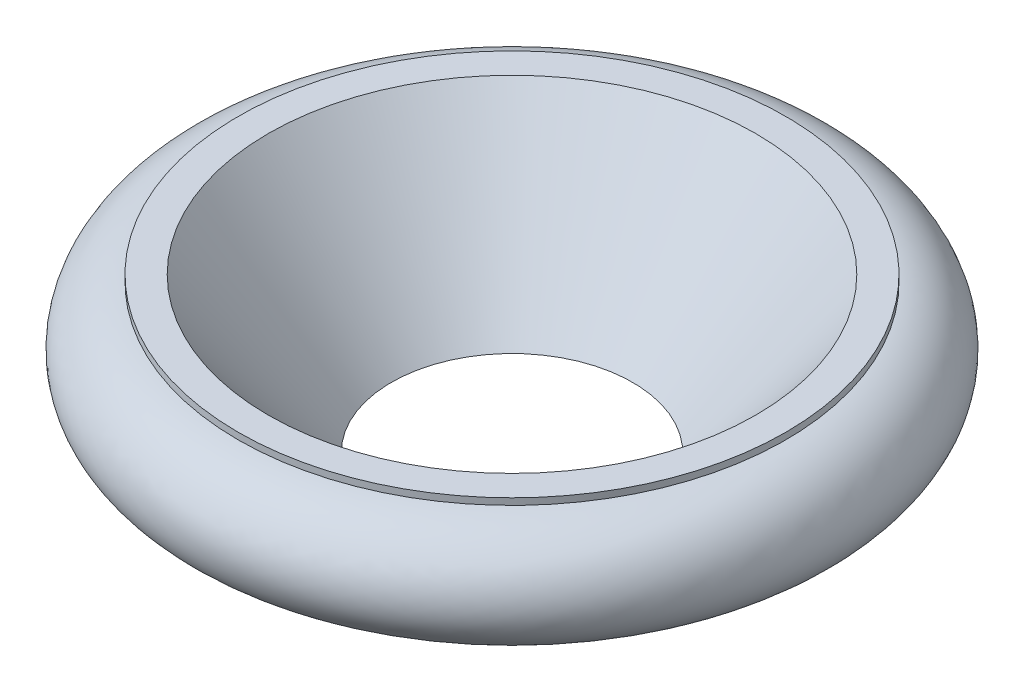
ISO-10303-21;
HEADER;
FILE_DESCRIPTION(('STEP AP214'),'2;1');
FILE_NAME('part.step','',(''),(''),'','','');
FILE_SCHEMA(('AUTOMOTIVE_DESIGN { 1 0 10303 214 1 1 1 1 }'));
ENDSEC;
DATA;
#1=APPLICATION_CONTEXT('core data for automotive mechanical design processes');
#2=APPLICATION_PROTOCOL_DEFINITION('international standard','automotive_design',2000,#1);
#3=PRODUCT_CONTEXT('',#1,'mechanical');
#4=PRODUCT('Part','Part','',(#3));
#5=PRODUCT_RELATED_PRODUCT_CATEGORY('part','',(#4));
#6=PRODUCT_DEFINITION_FORMATION('','',#4);
#7=PRODUCT_DEFINITION_CONTEXT('part definition',#1,'design');
#8=PRODUCT_DEFINITION('design','',#6,#7);
#9=PRODUCT_DEFINITION_SHAPE('','',#8);
#10=(LENGTH_UNIT() NAMED_UNIT(*) SI_UNIT(.MILLI.,.METRE.));
#11=(NAMED_UNIT(*) PLANE_ANGLE_UNIT() SI_UNIT($,.RADIAN.));
#12=(NAMED_UNIT(*) SI_UNIT($,.STERADIAN.) SOLID_ANGLE_UNIT());
#13=UNCERTAINTY_MEASURE_WITH_UNIT(LENGTH_MEASURE(1.E-05),#10,'distance_accuracy_value','');
#14=(GEOMETRIC_REPRESENTATION_CONTEXT(3) GLOBAL_UNCERTAINTY_ASSIGNED_CONTEXT((#13)) GLOBAL_UNIT_ASSIGNED_CONTEXT((#10,
#11,#12)) REPRESENTATION_CONTEXT('',''));
#15=CARTESIAN_POINT('',(0.,0.,0.));
#16=DIRECTION('',(0.,0.,1.));
#17=DIRECTION('',(1.,0.,0.));
#18=AXIS2_PLACEMENT_3D('',#15,#16,#17);
#19=CARTESIAN_POINT('',(0.,-18.5,0.));
#20=DIRECTION('',(0.,1.,0.));
#21=DIRECTION('',(0.,0.,1.));
#22=AXIS2_PLACEMENT_3D('',#19,#20,#21);
#23=CONICAL_SURFACE('',#22,8.23999999999999,0.674795878391532);
#24=CARTESIAN_POINT('',(0.,-18.5,0.));
#25=DIRECTION('',(0.,1.,0.));
#26=DIRECTION('',(0.,0.,1.));
#27=AXIS2_PLACEMENT_3D('',#24,#25,#26);
#28=CIRCLE('',#27,8.23999999999999);
#29=CARTESIAN_POINT('',(0.,-18.5,8.23999999999999));
#30=VERTEX_POINT('',#29);
#31=EDGE_CURVE('E10',#30,#30,#28,.T.);
#32=ORIENTED_EDGE('',*,*,#31,.F.);
#33=EDGE_LOOP('',(#32));
#34=FACE_BOUND('',#33,.T.);
#35=CARTESIAN_POINT('',(0.,-7.99150602508842,0.));
#36=DIRECTION('',(0.,-1.,0.));
#37=DIRECTION('',(1.,0.,0.));
#38=AXIS2_PLACEMENT_3D('',#35,#36,#37);
#39=CIRCLE('',#38,16.6477419876214);
#40=CARTESIAN_POINT('',(16.6477419876214,-7.99150602508842,0.));
#41=VERTEX_POINT('',#40);
#42=EDGE_CURVE('E53',#41,#41,#39,.T.);
#43=ORIENTED_EDGE('',*,*,#42,.F.);
#44=EDGE_LOOP('',(#43));
#45=FACE_BOUND('',#44,.T.);
#46=ADVANCED_FACE('F34',(#34,#45),#23,.F.);
#47=CARTESIAN_POINT('',(-8.23999999999999,-18.5,0.));
#48=DIRECTION('',(0.,-1.,0.));
#49=DIRECTION('',(0.,0.,-1.));
#50=AXIS2_PLACEMENT_3D('',#47,#48,#49);
#51=PLANE('',#50);
#52=CARTESIAN_POINT('',(0.,-18.5,0.));
#53=DIRECTION('',(0.,1.,0.));
#54=DIRECTION('',(0.,0.,1.));
#55=AXIS2_PLACEMENT_3D('',#52,#53,#54);
#56=CIRCLE('',#55,12.);
#57=CARTESIAN_POINT('',(0.,-18.5,12.));
#58=VERTEX_POINT('',#57);
#59=EDGE_CURVE('E40',#58,#58,#56,.T.);
#60=ORIENTED_EDGE('',*,*,#59,.F.);
#61=EDGE_LOOP('',(#60));
#62=FACE_BOUND('',#61,.T.);
#63=ORIENTED_EDGE('',*,*,#31,.T.);
#64=EDGE_LOOP('',(#63));
#65=FACE_BOUND('',#64,.T.);
#66=ADVANCED_FACE('F72',(#62,#65),#51,.T.);
#67=CARTESIAN_POINT('',(0.,0.,0.));
#68=DIRECTION('',(0.,1.,0.));
#69=DIRECTION('',(0.,0.,1.));
#70=AXIS2_PLACEMENT_3D('',#67,#68,#69);
#71=CYLINDRICAL_SURFACE('',#70,12.);
#72=CARTESIAN_POINT('',(0.,-16.7629595869485,0.));
#73=DIRECTION('',(0.,1.,0.));
#74=DIRECTION('',(0.,0.,1.));
#75=AXIS2_PLACEMENT_3D('',#72,#73,#74);
#76=CIRCLE('',#75,12.);
#77=CARTESIAN_POINT('',(0.,-16.7629595869485,12.));
#78=VERTEX_POINT('',#77);
#79=EDGE_CURVE('E44',#78,#78,#76,.T.);
#80=ORIENTED_EDGE('',*,*,#79,.F.);
#81=EDGE_LOOP('',(#80));
#82=FACE_BOUND('',#81,.T.);
#83=ORIENTED_EDGE('',*,*,#59,.T.);
#84=EDGE_LOOP('',(#83));
#85=FACE_BOUND('',#84,.T.);
#86=ADVANCED_FACE('F68',(#82,#85),#71,.T.);
#87=CARTESIAN_POINT('',(-18.6868825516761,-8.44286735814125,0.));
#88=CARTESIAN_POINT('',(-21.3252969557397,-8.75618115962415,0.));
#89=CARTESIAN_POINT('',(-23.4042612468183,-12.1434054080139,0.));
#90=CARTESIAN_POINT('',(-20.7867802365926,-16.0940402567218,0.));
#91=CARTESIAN_POINT('',(-16.0670393067712,-15.2935057025478,0.));
#92=CARTESIAN_POINT('',(-13.2304923419388,-14.1462209833225,0.));
#93=CARTESIAN_POINT('',(-12.,-16.7629595869485,0.));
#94=B_SPLINE_CURVE_WITH_KNOTS('',3,(#87,#88,#89,#90,#91,#92,#93),.UNSPECIFIED.,.F.,.F.,(4,1,1,1,
4),(0.,0.285339474234287,0.443341515792333,0.735352338554419,1.),.UNSPECIFIED.);
#95=CARTESIAN_POINT('',(0.,0.,0.));
#96=DIRECTION('',(0.,1.,0.));
#97=AXIS1_PLACEMENT('',#95,#96);
#98=SURFACE_OF_REVOLUTION('',#94,#97);
#99=CARTESIAN_POINT('',(0.,-8.44286735814126,0.));
#100=DIRECTION('',(0.,1.,0.));
#101=DIRECTION('',(0.,0.,1.));
#102=AXIS2_PLACEMENT_3D('',#99,#100,#101);
#103=CIRCLE('',#102,18.6868825516761);
#104=CARTESIAN_POINT('',(0.,-8.44286735814126,18.6868825516761));
#105=VERTEX_POINT('',#104);
#106=EDGE_CURVE('E48',#105,#105,#103,.T.);
#107=ORIENTED_EDGE('',*,*,#106,.F.);
#108=EDGE_LOOP('',(#107));
#109=FACE_BOUND('',#108,.T.);
#110=ORIENTED_EDGE('',*,*,#79,.T.);
#111=EDGE_LOOP('',(#110));
#112=FACE_BOUND('',#111,.T.);
#113=ADVANCED_FACE('F63',(#109,#112),#98,.F.);
#114=CARTESIAN_POINT('',(0.,0.,0.));
#115=DIRECTION('',(0.,1.,0.));
#116=DIRECTION('',(0.,0.,1.));
#117=AXIS2_PLACEMENT_3D('',#114,#115,#116);
#118=CYLINDRICAL_SURFACE('',#117,18.6868825516761);
#119=CARTESIAN_POINT('',(0.,-7.99150602508842,0.));
#120=DIRECTION('',(0.,-1.,0.));
#121=DIRECTION('',(1.,0.,0.));
#122=AXIS2_PLACEMENT_3D('',#119,#120,#121);
#123=CIRCLE('',#122,18.6868825516761);
#124=CARTESIAN_POINT('',(18.6868825516761,-7.99150602508842,0.));
#125=VERTEX_POINT('',#124);
#126=EDGE_CURVE('E89',#125,#125,#123,.F.);
#127=ORIENTED_EDGE('',*,*,#126,.F.);
#128=EDGE_LOOP('',(#127));
#129=FACE_BOUND('',#128,.T.);
#130=ORIENTED_EDGE('',*,*,#106,.T.);
#131=EDGE_LOOP('',(#130));
#132=FACE_BOUND('',#131,.T.);
#133=ADVANCED_FACE('F67',(#129,#132),#118,.T.);
#134=CARTESIAN_POINT('',(-103.,-7.99150602508844,28.0055211777231));
#135=DIRECTION('',(0.,-1.,0.));
#136=DIRECTION('',(1.,0.,0.));
#137=AXIS2_PLACEMENT_3D('',#134,#135,#136);
#138=PLANE('',#137);
#139=ORIENTED_EDGE('',*,*,#126,.T.);
#140=EDGE_LOOP('',(#139));
#141=FACE_BOUND('',#140,.T.);
#142=ORIENTED_EDGE('',*,*,#42,.T.);
#143=EDGE_LOOP('',(#142));
#144=FACE_BOUND('',#143,.T.);
#145=ADVANCED_FACE('F93',(#141,#144),#138,.F.);
#146=CLOSED_SHELL('',(#46,#66,#86,#113,#133,#145));
#147=MANIFOLD_SOLID_BREP('B2',#146);
#148=ADVANCED_BREP_SHAPE_REPRESENTATION('',(#18,#147),#14);
#149=SHAPE_DEFINITION_REPRESENTATION(#9,#148);
ENDSEC;
END-ISO-10303-21;
